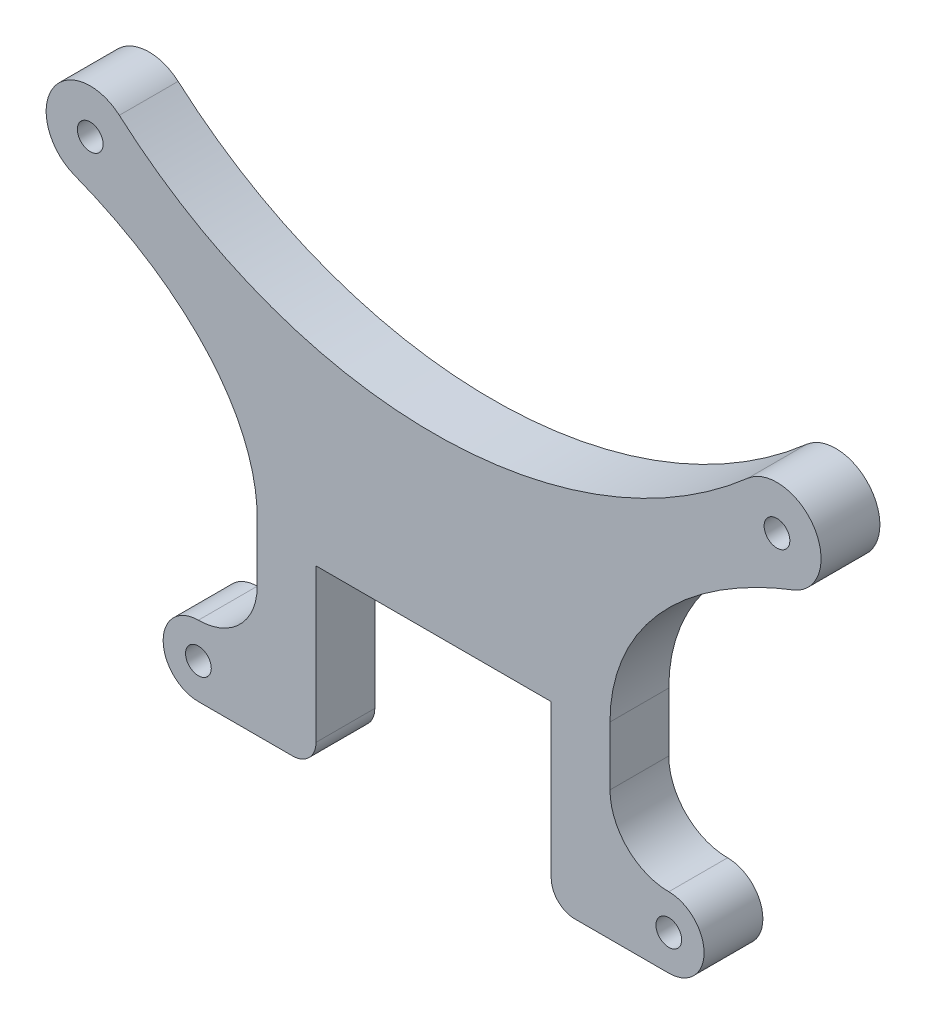
ISO-10303-21;
HEADER;
FILE_DESCRIPTION(('STEP AP214'),'2;1');
FILE_NAME('part.step','',(''),(''),'','','');
FILE_SCHEMA(('AUTOMOTIVE_DESIGN { 1 0 10303 214 1 1 1 1 }'));
ENDSEC;
DATA;
#1=APPLICATION_CONTEXT('core data for automotive mechanical design processes');
#2=APPLICATION_PROTOCOL_DEFINITION('international standard','automotive_design',2000,#1);
#3=PRODUCT_CONTEXT('',#1,'mechanical');
#4=PRODUCT('Part','Part','',(#3));
#5=PRODUCT_RELATED_PRODUCT_CATEGORY('part','',(#4));
#6=PRODUCT_DEFINITION_FORMATION('','',#4);
#7=PRODUCT_DEFINITION_CONTEXT('part definition',#1,'design');
#8=PRODUCT_DEFINITION('design','',#6,#7);
#9=PRODUCT_DEFINITION_SHAPE('','',#8);
#10=(LENGTH_UNIT() NAMED_UNIT(*) SI_UNIT(.MILLI.,.METRE.));
#11=(NAMED_UNIT(*) PLANE_ANGLE_UNIT() SI_UNIT($,.RADIAN.));
#12=(NAMED_UNIT(*) SI_UNIT($,.STERADIAN.) SOLID_ANGLE_UNIT());
#13=UNCERTAINTY_MEASURE_WITH_UNIT(LENGTH_MEASURE(1.E-05),#10,'distance_accuracy_value','');
#14=(GEOMETRIC_REPRESENTATION_CONTEXT(3) GLOBAL_UNCERTAINTY_ASSIGNED_CONTEXT((#13)) GLOBAL_UNIT_ASSIGNED_CONTEXT((#10,
#11,#12)) REPRESENTATION_CONTEXT('',''));
#15=CARTESIAN_POINT('',(0.,0.,0.));
#16=DIRECTION('',(0.,0.,1.));
#17=DIRECTION('',(1.,0.,0.));
#18=AXIS2_PLACEMENT_3D('',#15,#16,#17);
#19=CARTESIAN_POINT('',(-60.8178296691345,1.26999999999986,6.35));
#20=DIRECTION('',(0.,0.,-1.));
#21=DIRECTION('',(-1.,0.,0.));
#22=AXIS2_PLACEMENT_3D('',#19,#20,#21);
#23=PLANE('',#22);
#24=CARTESIAN_POINT('',(25.4,-15.24,6.35));
#25=DIRECTION('',(0.,0.,1.));
#26=DIRECTION('',(-1.,0.,0.));
#27=AXIS2_PLACEMENT_3D('',#24,#25,#26);
#28=CIRCLE('',#27,1.3890625);
#29=CARTESIAN_POINT('',(24.0109375,-15.24,6.35));
#30=VERTEX_POINT('',#29);
#31=EDGE_CURVE('E396',#30,#30,#28,.T.);
#32=ORIENTED_EDGE('',*,*,#31,.F.);
#33=EDGE_LOOP('',(#32));
#34=FACE_BOUND('',#33,.T.);
#35=CARTESIAN_POINT('',(-37.084,27.94,6.35));
#36=DIRECTION('',(0.,0.,1.));
#37=DIRECTION('',(1.,0.,0.));
#38=AXIS2_PLACEMENT_3D('',#35,#36,#37);
#39=CIRCLE('',#38,1.3890625);
#40=CARTESIAN_POINT('',(-35.6949375,27.94,6.35));
#41=VERTEX_POINT('',#40);
#42=EDGE_CURVE('E194',#41,#41,#39,.T.);
#43=ORIENTED_EDGE('',*,*,#42,.F.);
#44=EDGE_LOOP('',(#43));
#45=FACE_BOUND('',#44,.T.);
#46=DIRECTION('',(0.,1.,0.));
#47=VECTOR('',#46,1.);
#48=CARTESIAN_POINT('',(-12.7,0.,6.35));
#49=LINE('',#48,#47);
#50=CARTESIAN_POINT('',(-12.7,-16.51,6.35));
#51=VERTEX_POINT('',#50);
#52=CARTESIAN_POINT('',(-12.7,0.,6.35));
#53=VERTEX_POINT('',#52);
#54=EDGE_CURVE('E225',#51,#53,#49,.T.);
#55=ORIENTED_EDGE('',*,*,#54,.T.);
#56=DIRECTION('',(1.,0.,0.));
#57=VECTOR('',#56,1.);
#58=CARTESIAN_POINT('',(12.7,0.,6.35));
#59=LINE('',#58,#57);
#60=CARTESIAN_POINT('',(12.7,0.,6.35));
#61=VERTEX_POINT('',#60);
#62=EDGE_CURVE('E123',#53,#61,#59,.T.);
#63=ORIENTED_EDGE('',*,*,#62,.T.);
#64=DIRECTION('',(0.,-1.,0.));
#65=VECTOR('',#64,1.);
#66=CARTESIAN_POINT('',(12.7,0.,6.35));
#67=LINE('',#66,#65);
#68=CARTESIAN_POINT('',(12.7,-16.5099999999999,6.35));
#69=VERTEX_POINT('',#68);
#70=EDGE_CURVE('E270',#61,#69,#67,.T.);
#71=ORIENTED_EDGE('',*,*,#70,.T.);
#72=CARTESIAN_POINT('',(15.24,-16.5099999999999,6.35));
#73=DIRECTION('',(0.,0.,1.));
#74=DIRECTION('',(-1.,0.,0.));
#75=AXIS2_PLACEMENT_3D('',#72,#73,#74);
#76=CIRCLE('',#75,2.54);
#77=CARTESIAN_POINT('',(15.24,-19.0499999999999,6.35));
#78=VERTEX_POINT('',#77);
#79=EDGE_CURVE('E289',#69,#78,#76,.T.);
#80=ORIENTED_EDGE('',*,*,#79,.T.);
#81=DIRECTION('',(1.,0.,0.));
#82=VECTOR('',#81,1.);
#83=CARTESIAN_POINT('',(15.24,-19.0499999999999,6.35));
#84=LINE('',#83,#82);
#85=CARTESIAN_POINT('',(25.4,-19.05,6.35));
#86=VERTEX_POINT('',#85);
#87=EDGE_CURVE('E286',#78,#86,#84,.T.);
#88=ORIENTED_EDGE('',*,*,#87,.T.);
#89=CARTESIAN_POINT('',(25.4,-15.24,6.35));
#90=DIRECTION('',(0.,0.,1.));
#91=DIRECTION('',(1.,0.,0.));
#92=AXIS2_PLACEMENT_3D('',#89,#90,#91);
#93=CIRCLE('',#92,3.80999999999999);
#94=CARTESIAN_POINT('',(25.4,-11.43,6.35));
#95=VERTEX_POINT('',#94);
#96=EDGE_CURVE('E288',#86,#95,#93,.T.);
#97=ORIENTED_EDGE('',*,*,#96,.T.);
#98=CARTESIAN_POINT('',(25.4,-5.08,6.35));
#99=DIRECTION('',(0.,0.,-1.));
#100=DIRECTION('',(-1.,0.,0.));
#101=AXIS2_PLACEMENT_3D('',#98,#99,#100);
#102=CIRCLE('',#101,6.35);
#103=CARTESIAN_POINT('',(19.05,-5.08,6.35));
#104=VERTEX_POINT('',#103);
#105=EDGE_CURVE('E291',#95,#104,#102,.T.);
#106=ORIENTED_EDGE('',*,*,#105,.T.);
#107=DIRECTION('',(0.,1.,0.));
#108=VECTOR('',#107,1.);
#109=CARTESIAN_POINT('',(19.05,-5.08,6.35));
#110=LINE('',#109,#108);
#111=CARTESIAN_POINT('',(19.05,1.27,6.35));
#112=VERTEX_POINT('',#111);
#113=EDGE_CURVE('E297',#104,#112,#110,.T.);
#114=ORIENTED_EDGE('',*,*,#113,.T.);
#115=CARTESIAN_POINT('',(60.8178296691344,1.27000000000003,6.35));
#116=DIRECTION('',(0.,0.,-1.));
#117=DIRECTION('',(-1.,0.,0.));
#118=AXIS2_PLACEMENT_3D('',#115,#116,#117);
#119=ELLIPSE('',#118,41.7678296691344,26.1568362866993);
#120=CARTESIAN_POINT('',(38.8078478762059,23.5004334082438,6.35));
#121=VERTEX_POINT('',#120);
#122=EDGE_CURVE('E299',#112,#121,#119,.T.);
#123=ORIENTED_EDGE('',*,*,#122,.T.);
#124=CARTESIAN_POINT('',(37.084,27.94,6.35));
#125=DIRECTION('',(0.,0.,1.));
#126=DIRECTION('',(-1.,0.,0.));
#127=AXIS2_PLACEMENT_3D('',#124,#125,#126);
#128=CIRCLE('',#127,4.76249974590056);
#129=CARTESIAN_POINT('',(33.9417401947675,31.5187717370801,6.35));
#130=VERTEX_POINT('',#129);
#131=EDGE_CURVE('E302',#121,#130,#128,.T.);
#132=ORIENTED_EDGE('',*,*,#131,.T.);
#133=CARTESIAN_POINT('',(0.,70.1755818181818,6.35));
#134=DIRECTION('',(0.,0.,-1.));
#135=DIRECTION('',(-1.,0.,0.));
#136=AXIS2_PLACEMENT_3D('',#133,#134,#135);
#137=CIRCLE('',#136,51.4430819875814);
#138=CARTESIAN_POINT('',(-33.9417401388833,31.5187718007276,6.35));
#139=VERTEX_POINT('',#138);
#140=EDGE_CURVE('E589',#130,#139,#137,.T.);
#141=ORIENTED_EDGE('',*,*,#140,.T.);
#142=CARTESIAN_POINT('',(-37.084,27.94,6.35));
#143=DIRECTION('',(0.,0.,1.));
#144=DIRECTION('',(1.,0.,0.));
#145=AXIS2_PLACEMENT_3D('',#142,#143,#144);
#146=CIRCLE('',#145,4.76249974590056);
#147=CARTESIAN_POINT('',(-38.807847906864,23.5004333292873,6.35));
#148=VERTEX_POINT('',#147);
#149=EDGE_CURVE('E375',#139,#148,#146,.T.);
#150=ORIENTED_EDGE('',*,*,#149,.T.);
#151=CARTESIAN_POINT('',(-60.8178296691345,1.26999999999986,6.35));
#152=DIRECTION('',(0.,0.,-1.));
#153=DIRECTION('',(1.,0.,0.));
#154=AXIS2_PLACEMENT_3D('',#151,#152,#153);
#155=ELLIPSE('',#154,41.7678296691345,26.1568362866994);
#156=CARTESIAN_POINT('',(-19.05,1.27,6.35));
#157=VERTEX_POINT('',#156);
#158=EDGE_CURVE('E370',#148,#157,#155,.T.);
#159=ORIENTED_EDGE('',*,*,#158,.T.);
#160=DIRECTION('',(0.,-1.,0.));
#161=VECTOR('',#160,1.);
#162=CARTESIAN_POINT('',(-19.05,-5.08,6.35));
#163=LINE('',#162,#161);
#164=CARTESIAN_POINT('',(-19.05,-5.08,6.35));
#165=VERTEX_POINT('',#164);
#166=EDGE_CURVE('E374',#157,#165,#163,.T.);
#167=ORIENTED_EDGE('',*,*,#166,.T.);
#168=CARTESIAN_POINT('',(-25.4,-5.08,6.35));
#169=DIRECTION('',(0.,0.,-1.));
#170=DIRECTION('',(1.,0.,0.));
#171=AXIS2_PLACEMENT_3D('',#168,#169,#170);
#172=CIRCLE('',#171,6.35);
#173=CARTESIAN_POINT('',(-25.4,-11.43,6.35));
#174=VERTEX_POINT('',#173);
#175=EDGE_CURVE('E172',#165,#174,#172,.T.);
#176=ORIENTED_EDGE('',*,*,#175,.T.);
#177=CARTESIAN_POINT('',(-25.4,-15.24,6.35));
#178=DIRECTION('',(0.,0.,1.));
#179=DIRECTION('',(-1.,0.,0.));
#180=AXIS2_PLACEMENT_3D('',#177,#178,#179);
#181=CIRCLE('',#180,3.80999999999999);
#182=CARTESIAN_POINT('',(-25.4,-19.05,6.35));
#183=VERTEX_POINT('',#182);
#184=EDGE_CURVE('E166',#174,#183,#181,.T.);
#185=ORIENTED_EDGE('',*,*,#184,.T.);
#186=DIRECTION('',(1.,0.,0.));
#187=VECTOR('',#186,1.);
#188=CARTESIAN_POINT('',(-15.24,-19.05,6.35));
#189=LINE('',#188,#187);
#190=CARTESIAN_POINT('',(-15.24,-19.05,6.35));
#191=VERTEX_POINT('',#190);
#192=EDGE_CURVE('E170',#183,#191,#189,.T.);
#193=ORIENTED_EDGE('',*,*,#192,.T.);
#194=CARTESIAN_POINT('',(-15.24,-16.51,6.35));
#195=DIRECTION('',(0.,0.,1.));
#196=DIRECTION('',(1.,0.,0.));
#197=AXIS2_PLACEMENT_3D('',#194,#195,#196);
#198=CIRCLE('',#197,2.54);
#199=EDGE_CURVE('E50',#191,#51,#198,.T.);
#200=ORIENTED_EDGE('',*,*,#199,.T.);
#201=EDGE_LOOP('',(#55,#63,#71,#80,#88,#97,#106,#114,#123,#132,#141,#150,#159,#167,#176,#185,
#193,#200));
#202=FACE_BOUND('',#201,.T.);
#203=CARTESIAN_POINT('',(-25.4,-15.24,6.35));
#204=DIRECTION('',(0.,0.,1.));
#205=DIRECTION('',(1.,0.,0.));
#206=AXIS2_PLACEMENT_3D('',#203,#204,#205);
#207=CIRCLE('',#206,1.3890625);
#208=CARTESIAN_POINT('',(-24.0109375,-15.24,6.35));
#209=VERTEX_POINT('',#208);
#210=EDGE_CURVE('E390',#209,#209,#207,.T.);
#211=ORIENTED_EDGE('',*,*,#210,.F.);
#212=EDGE_LOOP('',(#211));
#213=FACE_BOUND('',#212,.T.);
#214=CARTESIAN_POINT('',(37.084,27.94,6.35));
#215=DIRECTION('',(0.,0.,1.));
#216=DIRECTION('',(-1.,0.,0.));
#217=AXIS2_PLACEMENT_3D('',#214,#215,#216);
#218=CIRCLE('',#217,1.3890625);
#219=CARTESIAN_POINT('',(35.6949375,27.94,6.35));
#220=VERTEX_POINT('',#219);
#221=EDGE_CURVE('E402',#220,#220,#218,.T.);
#222=ORIENTED_EDGE('',*,*,#221,.F.);
#223=EDGE_LOOP('',(#222));
#224=FACE_BOUND('',#223,.T.);
#225=ADVANCED_FACE('F33',(#34,#45,#202,#213,#224),#23,.F.);
#226=CARTESIAN_POINT('',(-60.8178296691345,1.26999999999986,0.));
#227=DIRECTION('',(0.,0.,-1.));
#228=DIRECTION('',(-1.,0.,0.));
#229=AXIS2_PLACEMENT_3D('',#226,#227,#228);
#230=PLANE('',#229);
#231=CARTESIAN_POINT('',(25.4,-15.24,0.));
#232=DIRECTION('',(0.,0.,1.));
#233=DIRECTION('',(-1.,0.,0.));
#234=AXIS2_PLACEMENT_3D('',#231,#232,#233);
#235=CIRCLE('',#234,1.3890625);
#236=CARTESIAN_POINT('',(24.0109375,-15.24,0.));
#237=VERTEX_POINT('',#236);
#238=EDGE_CURVE('E399',#237,#237,#235,.T.);
#239=ORIENTED_EDGE('',*,*,#238,.T.);
#240=EDGE_LOOP('',(#239));
#241=FACE_BOUND('',#240,.T.);
#242=CARTESIAN_POINT('',(-37.084,27.94,0.));
#243=DIRECTION('',(0.,0.,1.));
#244=DIRECTION('',(1.,0.,0.));
#245=AXIS2_PLACEMENT_3D('',#242,#243,#244);
#246=CIRCLE('',#245,1.3890625);
#247=CARTESIAN_POINT('',(-35.6949375,27.94,0.));
#248=VERTEX_POINT('',#247);
#249=EDGE_CURVE('E387',#248,#248,#246,.T.);
#250=ORIENTED_EDGE('',*,*,#249,.T.);
#251=EDGE_LOOP('',(#250));
#252=FACE_BOUND('',#251,.T.);
#253=DIRECTION('',(0.,1.,0.));
#254=VECTOR('',#253,1.);
#255=CARTESIAN_POINT('',(-12.7,0.,0.));
#256=LINE('',#255,#254);
#257=CARTESIAN_POINT('',(-12.7,-16.51,0.));
#258=VERTEX_POINT('',#257);
#259=CARTESIAN_POINT('',(-12.7,0.,0.));
#260=VERTEX_POINT('',#259);
#261=EDGE_CURVE('E190',#258,#260,#256,.T.);
#262=ORIENTED_EDGE('',*,*,#261,.F.);
#263=CARTESIAN_POINT('',(-15.24,-16.51,0.));
#264=DIRECTION('',(0.,0.,1.));
#265=DIRECTION('',(1.,0.,0.));
#266=AXIS2_PLACEMENT_3D('',#263,#264,#265);
#267=CIRCLE('',#266,2.54);
#268=CARTESIAN_POINT('',(-15.24,-19.05,0.));
#269=VERTEX_POINT('',#268);
#270=EDGE_CURVE('E115',#269,#258,#267,.T.);
#271=ORIENTED_EDGE('',*,*,#270,.F.);
#272=DIRECTION('',(1.,0.,0.));
#273=VECTOR('',#272,1.);
#274=CARTESIAN_POINT('',(-15.24,-19.05,0.));
#275=LINE('',#274,#273);
#276=CARTESIAN_POINT('',(-25.4,-19.05,0.));
#277=VERTEX_POINT('',#276);
#278=EDGE_CURVE('E109',#277,#269,#275,.T.);
#279=ORIENTED_EDGE('',*,*,#278,.F.);
#280=CARTESIAN_POINT('',(-25.4,-15.24,0.));
#281=DIRECTION('',(0.,0.,1.));
#282=DIRECTION('',(-1.,0.,0.));
#283=AXIS2_PLACEMENT_3D('',#280,#281,#282);
#284=CIRCLE('',#283,3.80999999999999);
#285=CARTESIAN_POINT('',(-25.4,-11.43,0.));
#286=VERTEX_POINT('',#285);
#287=EDGE_CURVE('E180',#286,#277,#284,.T.);
#288=ORIENTED_EDGE('',*,*,#287,.F.);
#289=CARTESIAN_POINT('',(-25.4,-5.08,0.));
#290=DIRECTION('',(0.,0.,-1.));
#291=DIRECTION('',(1.,0.,0.));
#292=AXIS2_PLACEMENT_3D('',#289,#290,#291);
#293=CIRCLE('',#292,6.35);
#294=CARTESIAN_POINT('',(-19.05,-5.08,0.));
#295=VERTEX_POINT('',#294);
#296=EDGE_CURVE('E220',#295,#286,#293,.T.);
#297=ORIENTED_EDGE('',*,*,#296,.F.);
#298=DIRECTION('',(0.,-1.,0.));
#299=VECTOR('',#298,1.);
#300=CARTESIAN_POINT('',(-19.05,-5.08,0.));
#301=LINE('',#300,#299);
#302=CARTESIAN_POINT('',(-19.05,1.27,0.));
#303=VERTEX_POINT('',#302);
#304=EDGE_CURVE('E218',#303,#295,#301,.T.);
#305=ORIENTED_EDGE('',*,*,#304,.F.);
#306=CARTESIAN_POINT('',(-60.8178296691345,1.26999999999986,0.));
#307=DIRECTION('',(0.,0.,-1.));
#308=DIRECTION('',(1.,0.,0.));
#309=AXIS2_PLACEMENT_3D('',#306,#307,#308);
#310=ELLIPSE('',#309,41.7678296691345,26.1568362866994);
#311=CARTESIAN_POINT('',(-38.807847906864,23.5004333292873,0.));
#312=VERTEX_POINT('',#311);
#313=EDGE_CURVE('E216',#312,#303,#310,.T.);
#314=ORIENTED_EDGE('',*,*,#313,.F.);
#315=CARTESIAN_POINT('',(-37.084,27.94,0.));
#316=DIRECTION('',(0.,0.,1.));
#317=DIRECTION('',(1.,0.,0.));
#318=AXIS2_PLACEMENT_3D('',#315,#316,#317);
#319=CIRCLE('',#318,4.76249974590056);
#320=CARTESIAN_POINT('',(-33.9417401388833,31.5187718007276,0.));
#321=VERTEX_POINT('',#320);
#322=EDGE_CURVE('E214',#321,#312,#319,.T.);
#323=ORIENTED_EDGE('',*,*,#322,.F.);
#324=CARTESIAN_POINT('',(0.,70.1755818181818,0.));
#325=DIRECTION('',(0.,0.,-1.));
#326=DIRECTION('',(-1.,0.,0.));
#327=AXIS2_PLACEMENT_3D('',#324,#325,#326);
#328=CIRCLE('',#327,51.4430819875814);
#329=CARTESIAN_POINT('',(33.9417401947675,31.5187717370801,0.));
#330=VERTEX_POINT('',#329);
#331=EDGE_CURVE('E212',#330,#321,#328,.T.);
#332=ORIENTED_EDGE('',*,*,#331,.F.);
#333=CARTESIAN_POINT('',(37.084,27.94,0.));
#334=DIRECTION('',(0.,0.,1.));
#335=DIRECTION('',(-1.,0.,0.));
#336=AXIS2_PLACEMENT_3D('',#333,#334,#335);
#337=CIRCLE('',#336,4.76249974590056);
#338=CARTESIAN_POINT('',(38.8078478762059,23.5004334082438,0.));
#339=VERTEX_POINT('',#338);
#340=EDGE_CURVE('E210',#339,#330,#337,.T.);
#341=ORIENTED_EDGE('',*,*,#340,.F.);
#342=CARTESIAN_POINT('',(60.8178296691344,1.27000000000003,0.));
#343=DIRECTION('',(0.,0.,-1.));
#344=DIRECTION('',(-1.,0.,0.));
#345=AXIS2_PLACEMENT_3D('',#342,#343,#344);
#346=ELLIPSE('',#345,41.7678296691344,26.1568362866993);
#347=CARTESIAN_POINT('',(19.05,1.27,0.));
#348=VERTEX_POINT('',#347);
#349=EDGE_CURVE('E208',#348,#339,#346,.T.);
#350=ORIENTED_EDGE('',*,*,#349,.F.);
#351=DIRECTION('',(0.,1.,0.));
#352=VECTOR('',#351,1.);
#353=CARTESIAN_POINT('',(19.05,-5.08,0.));
#354=LINE('',#353,#352);
#355=CARTESIAN_POINT('',(19.05,-5.08,0.));
#356=VERTEX_POINT('',#355);
#357=EDGE_CURVE('E206',#356,#348,#354,.T.);
#358=ORIENTED_EDGE('',*,*,#357,.F.);
#359=CARTESIAN_POINT('',(25.4,-5.08,0.));
#360=DIRECTION('',(0.,0.,-1.));
#361=DIRECTION('',(-1.,0.,0.));
#362=AXIS2_PLACEMENT_3D('',#359,#360,#361);
#363=CIRCLE('',#362,6.35);
#364=CARTESIAN_POINT('',(25.4,-11.43,0.));
#365=VERTEX_POINT('',#364);
#366=EDGE_CURVE('E204',#365,#356,#363,.T.);
#367=ORIENTED_EDGE('',*,*,#366,.F.);
#368=CARTESIAN_POINT('',(25.4,-15.24,0.));
#369=DIRECTION('',(0.,0.,1.));
#370=DIRECTION('',(1.,0.,0.));
#371=AXIS2_PLACEMENT_3D('',#368,#369,#370);
#372=CIRCLE('',#371,3.80999999999999);
#373=CARTESIAN_POINT('',(25.4,-19.05,0.));
#374=VERTEX_POINT('',#373);
#375=EDGE_CURVE('E202',#374,#365,#372,.T.);
#376=ORIENTED_EDGE('',*,*,#375,.F.);
#377=DIRECTION('',(1.,0.,0.));
#378=VECTOR('',#377,1.);
#379=CARTESIAN_POINT('',(15.24,-19.0499999999999,0.));
#380=LINE('',#379,#378);
#381=CARTESIAN_POINT('',(15.24,-19.0499999999999,0.));
#382=VERTEX_POINT('',#381);
#383=EDGE_CURVE('E200',#382,#374,#380,.T.);
#384=ORIENTED_EDGE('',*,*,#383,.F.);
#385=CARTESIAN_POINT('',(15.24,-16.5099999999999,0.));
#386=DIRECTION('',(0.,0.,1.));
#387=DIRECTION('',(-1.,0.,0.));
#388=AXIS2_PLACEMENT_3D('',#385,#386,#387);
#389=CIRCLE('',#388,2.54);
#390=CARTESIAN_POINT('',(12.7,-16.5099999999999,0.));
#391=VERTEX_POINT('',#390);
#392=EDGE_CURVE('E198',#391,#382,#389,.T.);
#393=ORIENTED_EDGE('',*,*,#392,.F.);
#394=DIRECTION('',(0.,-1.,0.));
#395=VECTOR('',#394,1.);
#396=CARTESIAN_POINT('',(12.7,0.,0.));
#397=LINE('',#396,#395);
#398=CARTESIAN_POINT('',(12.7,0.,0.));
#399=VERTEX_POINT('',#398);
#400=EDGE_CURVE('E196',#399,#391,#397,.T.);
#401=ORIENTED_EDGE('',*,*,#400,.F.);
#402=DIRECTION('',(1.,0.,0.));
#403=VECTOR('',#402,1.);
#404=CARTESIAN_POINT('',(12.7,0.,0.));
#405=LINE('',#404,#403);
#406=EDGE_CURVE('E193',#260,#399,#405,.T.);
#407=ORIENTED_EDGE('',*,*,#406,.F.);
#408=EDGE_LOOP('',(#262,#271,#279,#288,#297,#305,#314,#323,#332,#341,#350,#358,#367,#376,#384,
#393,#401,#407));
#409=FACE_BOUND('',#408,.T.);
#410=CARTESIAN_POINT('',(-25.4,-15.24,0.));
#411=DIRECTION('',(0.,0.,1.));
#412=DIRECTION('',(1.,0.,0.));
#413=AXIS2_PLACEMENT_3D('',#410,#411,#412);
#414=CIRCLE('',#413,1.3890625);
#415=CARTESIAN_POINT('',(-24.0109375,-15.24,0.));
#416=VERTEX_POINT('',#415);
#417=EDGE_CURVE('E393',#416,#416,#414,.T.);
#418=ORIENTED_EDGE('',*,*,#417,.T.);
#419=EDGE_LOOP('',(#418));
#420=FACE_BOUND('',#419,.T.);
#421=CARTESIAN_POINT('',(37.084,27.94,0.));
#422=DIRECTION('',(0.,0.,1.));
#423=DIRECTION('',(-1.,0.,0.));
#424=AXIS2_PLACEMENT_3D('',#421,#422,#423);
#425=CIRCLE('',#424,1.3890625);
#426=CARTESIAN_POINT('',(35.6949375,27.94,0.));
#427=VERTEX_POINT('',#426);
#428=EDGE_CURVE('E405',#427,#427,#425,.T.);
#429=ORIENTED_EDGE('',*,*,#428,.T.);
#430=EDGE_LOOP('',(#429));
#431=FACE_BOUND('',#430,.T.);
#432=ADVANCED_FACE('F274',(#241,#252,#409,#420,#431),#230,.T.);
#433=CARTESIAN_POINT('',(-12.7,0.,6.35));
#434=DIRECTION('',(-1.,0.,0.));
#435=DIRECTION('',(0.,-1.,0.));
#436=AXIS2_PLACEMENT_3D('',#433,#434,#435);
#437=PLANE('',#436);
#438=ORIENTED_EDGE('',*,*,#261,.T.);
#439=DIRECTION('',(0.,0.,-1.));
#440=VECTOR('',#439,1.);
#441=CARTESIAN_POINT('',(-12.7,0.,6.35));
#442=LINE('',#441,#440);
#443=EDGE_CURVE('E11',#53,#260,#442,.T.);
#444=ORIENTED_EDGE('',*,*,#443,.F.);
#445=ORIENTED_EDGE('',*,*,#54,.F.);
#446=DIRECTION('',(0.,0.,-1.));
#447=VECTOR('',#446,1.);
#448=CARTESIAN_POINT('',(-12.7,-16.51,6.35));
#449=LINE('',#448,#447);
#450=EDGE_CURVE('E186',#51,#258,#449,.T.);
#451=ORIENTED_EDGE('',*,*,#450,.T.);
#452=EDGE_LOOP('',(#438,#444,#445,#451));
#453=FACE_BOUND('',#452,.T.);
#454=ADVANCED_FACE('F35',(#453),#437,.F.);
#455=CARTESIAN_POINT('',(12.7,0.,6.35));
#456=DIRECTION('',(0.,1.,0.));
#457=DIRECTION('',(-1.,0.,0.));
#458=AXIS2_PLACEMENT_3D('',#455,#456,#457);
#459=PLANE('',#458);
#460=ORIENTED_EDGE('',*,*,#406,.T.);
#461=DIRECTION('',(0.,0.,-1.));
#462=VECTOR('',#461,1.);
#463=CARTESIAN_POINT('',(12.7,0.,6.35));
#464=LINE('',#463,#462);
#465=EDGE_CURVE('E42',#61,#399,#464,.T.);
#466=ORIENTED_EDGE('',*,*,#465,.F.);
#467=ORIENTED_EDGE('',*,*,#62,.F.);
#468=ORIENTED_EDGE('',*,*,#443,.T.);
#469=EDGE_LOOP('',(#460,#466,#467,#468));
#470=FACE_BOUND('',#469,.T.);
#471=ADVANCED_FACE('F329',(#470),#459,.F.);
#472=CARTESIAN_POINT('',(12.7,0.,6.35));
#473=DIRECTION('',(1.,0.,0.));
#474=DIRECTION('',(0.,1.,0.));
#475=AXIS2_PLACEMENT_3D('',#472,#473,#474);
#476=PLANE('',#475);
#477=ORIENTED_EDGE('',*,*,#400,.T.);
#478=DIRECTION('',(0.,0.,-1.));
#479=VECTOR('',#478,1.);
#480=CARTESIAN_POINT('',(12.7,-16.5099999999999,6.35));
#481=LINE('',#480,#479);
#482=EDGE_CURVE('E262',#69,#391,#481,.T.);
#483=ORIENTED_EDGE('',*,*,#482,.F.);
#484=ORIENTED_EDGE('',*,*,#70,.F.);
#485=ORIENTED_EDGE('',*,*,#465,.T.);
#486=EDGE_LOOP('',(#477,#483,#484,#485));
#487=FACE_BOUND('',#486,.T.);
#488=ADVANCED_FACE('F268',(#487),#476,.F.);
#489=CARTESIAN_POINT('',(15.24,-16.5099999999999,6.35));
#490=DIRECTION('',(0.,0.,-1.));
#491=DIRECTION('',(-1.,0.,0.));
#492=AXIS2_PLACEMENT_3D('',#489,#490,#491);
#493=CYLINDRICAL_SURFACE('',#492,2.54);
#494=ORIENTED_EDGE('',*,*,#392,.T.);
#495=DIRECTION('',(0.,0.,-1.));
#496=VECTOR('',#495,1.);
#497=CARTESIAN_POINT('',(15.24,-19.0499999999999,6.35));
#498=LINE('',#497,#496);
#499=EDGE_CURVE('E259',#78,#382,#498,.T.);
#500=ORIENTED_EDGE('',*,*,#499,.F.);
#501=ORIENTED_EDGE('',*,*,#79,.F.);
#502=ORIENTED_EDGE('',*,*,#482,.T.);
#503=EDGE_LOOP('',(#494,#500,#501,#502));
#504=FACE_BOUND('',#503,.T.);
#505=ADVANCED_FACE('F280',(#504),#493,.T.);
#506=CARTESIAN_POINT('',(15.24,-19.0499999999999,6.35));
#507=DIRECTION('',(0.,1.,0.));
#508=DIRECTION('',(-1.,0.,0.));
#509=AXIS2_PLACEMENT_3D('',#506,#507,#508);
#510=PLANE('',#509);
#511=ORIENTED_EDGE('',*,*,#383,.T.);
#512=DIRECTION('',(0.,0.,-1.));
#513=VECTOR('',#512,1.);
#514=CARTESIAN_POINT('',(25.4,-19.05,6.35));
#515=LINE('',#514,#513);
#516=EDGE_CURVE('E256',#86,#374,#515,.T.);
#517=ORIENTED_EDGE('',*,*,#516,.F.);
#518=ORIENTED_EDGE('',*,*,#87,.F.);
#519=ORIENTED_EDGE('',*,*,#499,.T.);
#520=EDGE_LOOP('',(#511,#517,#518,#519));
#521=FACE_BOUND('',#520,.T.);
#522=ADVANCED_FACE('F284',(#521),#510,.F.);
#523=CARTESIAN_POINT('',(25.4,-15.24,6.35));
#524=DIRECTION('',(0.,0.,-1.));
#525=DIRECTION('',(-1.,0.,0.));
#526=AXIS2_PLACEMENT_3D('',#523,#524,#525);
#527=CYLINDRICAL_SURFACE('',#526,3.80999999999999);
#528=ORIENTED_EDGE('',*,*,#375,.T.);
#529=DIRECTION('',(0.,0.,-1.));
#530=VECTOR('',#529,1.);
#531=CARTESIAN_POINT('',(25.4,-11.43,6.35));
#532=LINE('',#531,#530);
#533=EDGE_CURVE('E253',#95,#365,#532,.T.);
#534=ORIENTED_EDGE('',*,*,#533,.F.);
#535=ORIENTED_EDGE('',*,*,#96,.F.);
#536=ORIENTED_EDGE('',*,*,#516,.T.);
#537=EDGE_LOOP('',(#528,#534,#535,#536));
#538=FACE_BOUND('',#537,.T.);
#539=ADVANCED_FACE('F319',(#538),#527,.T.);
#540=CARTESIAN_POINT('',(25.4,-5.08,6.35));
#541=DIRECTION('',(0.,0.,-1.));
#542=DIRECTION('',(-1.,0.,0.));
#543=AXIS2_PLACEMENT_3D('',#540,#541,#542);
#544=CYLINDRICAL_SURFACE('',#543,6.35);
#545=ORIENTED_EDGE('',*,*,#366,.T.);
#546=DIRECTION('',(0.,0.,-1.));
#547=VECTOR('',#546,1.);
#548=CARTESIAN_POINT('',(19.05,-5.08,6.35));
#549=LINE('',#548,#547);
#550=EDGE_CURVE('E250',#104,#356,#549,.T.);
#551=ORIENTED_EDGE('',*,*,#550,.F.);
#552=ORIENTED_EDGE('',*,*,#105,.F.);
#553=ORIENTED_EDGE('',*,*,#533,.T.);
#554=EDGE_LOOP('',(#545,#551,#552,#553));
#555=FACE_BOUND('',#554,.T.);
#556=ADVANCED_FACE('F315',(#555),#544,.F.);
#557=CARTESIAN_POINT('',(19.05,-5.08,6.35));
#558=DIRECTION('',(-1.,0.,0.));
#559=DIRECTION('',(0.,-1.,0.));
#560=AXIS2_PLACEMENT_3D('',#557,#558,#559);
#561=PLANE('',#560);
#562=ORIENTED_EDGE('',*,*,#357,.T.);
#563=DIRECTION('',(0.,0.,-1.));
#564=VECTOR('',#563,1.);
#565=CARTESIAN_POINT('',(19.05,1.27,6.35));
#566=LINE('',#565,#564);
#567=EDGE_CURVE('E247',#112,#348,#566,.T.);
#568=ORIENTED_EDGE('',*,*,#567,.F.);
#569=ORIENTED_EDGE('',*,*,#113,.F.);
#570=ORIENTED_EDGE('',*,*,#550,.T.);
#571=EDGE_LOOP('',(#562,#568,#569,#570));
#572=FACE_BOUND('',#571,.T.);
#573=ADVANCED_FACE('F310',(#572),#561,.F.);
#574=DIRECTION('',(0.,0.,-1.));
#575=VECTOR('',#574,1.);
#576=SURFACE_OF_LINEAR_EXTRUSION('',#119,#575);
#577=ORIENTED_EDGE('',*,*,#349,.T.);
#578=DIRECTION('',(0.,0.,-1.));
#579=VECTOR('',#578,1.);
#580=CARTESIAN_POINT('',(38.8078478762059,23.5004334082438,6.35));
#581=LINE('',#580,#579);
#582=EDGE_CURVE('E244',#121,#339,#581,.T.);
#583=ORIENTED_EDGE('',*,*,#582,.F.);
#584=ORIENTED_EDGE('',*,*,#122,.F.);
#585=ORIENTED_EDGE('',*,*,#567,.T.);
#586=EDGE_LOOP('',(#577,#583,#584,#585));
#587=FACE_BOUND('',#586,.T.);
#588=ADVANCED_FACE('F305',(#587),#576,.F.);
#589=CARTESIAN_POINT('',(37.084,27.94,6.35));
#590=DIRECTION('',(0.,0.,-1.));
#591=DIRECTION('',(-1.,0.,0.));
#592=AXIS2_PLACEMENT_3D('',#589,#590,#591);
#593=CYLINDRICAL_SURFACE('',#592,4.76249974590056);
#594=ORIENTED_EDGE('',*,*,#340,.T.);
#595=DIRECTION('',(0.,0.,-1.));
#596=VECTOR('',#595,1.);
#597=CARTESIAN_POINT('',(33.9417401947675,31.5187717370801,6.35));
#598=LINE('',#597,#596);
#599=EDGE_CURVE('E241',#130,#330,#598,.T.);
#600=ORIENTED_EDGE('',*,*,#599,.F.);
#601=ORIENTED_EDGE('',*,*,#131,.F.);
#602=ORIENTED_EDGE('',*,*,#582,.T.);
#603=EDGE_LOOP('',(#594,#600,#601,#602));
#604=FACE_BOUND('',#603,.T.);
#605=ADVANCED_FACE('F309',(#604),#593,.T.);
#606=CARTESIAN_POINT('',(0.,70.1755818181818,6.35));
#607=DIRECTION('',(0.,0.,-1.));
#608=DIRECTION('',(-1.,0.,0.));
#609=AXIS2_PLACEMENT_3D('',#606,#607,#608);
#610=CYLINDRICAL_SURFACE('',#609,51.4430819875814);
#611=ORIENTED_EDGE('',*,*,#331,.T.);
#612=DIRECTION('',(0.,0.,-1.));
#613=VECTOR('',#612,1.);
#614=CARTESIAN_POINT('',(-33.9417401388833,31.5187718007276,6.35));
#615=LINE('',#614,#613);
#616=EDGE_CURVE('E238',#139,#321,#615,.T.);
#617=ORIENTED_EDGE('',*,*,#616,.F.);
#618=ORIENTED_EDGE('',*,*,#140,.F.);
#619=ORIENTED_EDGE('',*,*,#599,.T.);
#620=EDGE_LOOP('',(#611,#617,#618,#619));
#621=FACE_BOUND('',#620,.T.);
#622=ADVANCED_FACE('F470',(#621),#610,.F.);
#623=CARTESIAN_POINT('',(-37.084,27.94,6.35));
#624=DIRECTION('',(0.,0.,-1.));
#625=DIRECTION('',(-1.,0.,0.));
#626=AXIS2_PLACEMENT_3D('',#623,#624,#625);
#627=CYLINDRICAL_SURFACE('',#626,4.76249974590056);
#628=ORIENTED_EDGE('',*,*,#322,.T.);
#629=DIRECTION('',(0.,0.,-1.));
#630=VECTOR('',#629,1.);
#631=CARTESIAN_POINT('',(-38.807847906864,23.5004333292873,6.35));
#632=LINE('',#631,#630);
#633=EDGE_CURVE('E235',#148,#312,#632,.T.);
#634=ORIENTED_EDGE('',*,*,#633,.F.);
#635=ORIENTED_EDGE('',*,*,#149,.F.);
#636=ORIENTED_EDGE('',*,*,#616,.T.);
#637=EDGE_LOOP('',(#628,#634,#635,#636));
#638=FACE_BOUND('',#637,.T.);
#639=ADVANCED_FACE('F368',(#638),#627,.T.);
#640=DIRECTION('',(0.,0.,-1.));
#641=VECTOR('',#640,1.);
#642=SURFACE_OF_LINEAR_EXTRUSION('',#155,#641);
#643=ORIENTED_EDGE('',*,*,#313,.T.);
#644=DIRECTION('',(0.,0.,-1.));
#645=VECTOR('',#644,1.);
#646=CARTESIAN_POINT('',(-19.05,1.27,6.35));
#647=LINE('',#646,#645);
#648=EDGE_CURVE('E232',#157,#303,#647,.T.);
#649=ORIENTED_EDGE('',*,*,#648,.F.);
#650=ORIENTED_EDGE('',*,*,#158,.F.);
#651=ORIENTED_EDGE('',*,*,#633,.T.);
#652=EDGE_LOOP('',(#643,#649,#650,#651));
#653=FACE_BOUND('',#652,.T.);
#654=ADVANCED_FACE('F363',(#653),#642,.F.);
#655=CARTESIAN_POINT('',(-19.05,-5.08,6.35));
#656=DIRECTION('',(1.,0.,0.));
#657=DIRECTION('',(0.,1.,0.));
#658=AXIS2_PLACEMENT_3D('',#655,#656,#657);
#659=PLANE('',#658);
#660=ORIENTED_EDGE('',*,*,#304,.T.);
#661=DIRECTION('',(0.,0.,-1.));
#662=VECTOR('',#661,1.);
#663=CARTESIAN_POINT('',(-19.05,-5.08,6.35));
#664=LINE('',#663,#662);
#665=EDGE_CURVE('E229',#165,#295,#664,.T.);
#666=ORIENTED_EDGE('',*,*,#665,.F.);
#667=ORIENTED_EDGE('',*,*,#166,.F.);
#668=ORIENTED_EDGE('',*,*,#648,.T.);
#669=EDGE_LOOP('',(#660,#666,#667,#668));
#670=FACE_BOUND('',#669,.T.);
#671=ADVANCED_FACE('F359',(#670),#659,.F.);
#672=CARTESIAN_POINT('',(-25.4,-5.08,6.35));
#673=DIRECTION('',(0.,0.,-1.));
#674=DIRECTION('',(-1.,0.,0.));
#675=AXIS2_PLACEMENT_3D('',#672,#673,#674);
#676=CYLINDRICAL_SURFACE('',#675,6.35);
#677=ORIENTED_EDGE('',*,*,#296,.T.);
#678=DIRECTION('',(0.,0.,-1.));
#679=VECTOR('',#678,1.);
#680=CARTESIAN_POINT('',(-25.4,-11.43,6.35));
#681=LINE('',#680,#679);
#682=EDGE_CURVE('E181',#174,#286,#681,.T.);
#683=ORIENTED_EDGE('',*,*,#682,.F.);
#684=ORIENTED_EDGE('',*,*,#175,.F.);
#685=ORIENTED_EDGE('',*,*,#665,.T.);
#686=EDGE_LOOP('',(#677,#683,#684,#685));
#687=FACE_BOUND('',#686,.T.);
#688=ADVANCED_FACE('F356',(#687),#676,.F.);
#689=CARTESIAN_POINT('',(-25.4,-15.24,6.35));
#690=DIRECTION('',(0.,0.,-1.));
#691=DIRECTION('',(-1.,0.,0.));
#692=AXIS2_PLACEMENT_3D('',#689,#690,#691);
#693=CYLINDRICAL_SURFACE('',#692,3.80999999999999);
#694=ORIENTED_EDGE('',*,*,#287,.T.);
#695=DIRECTION('',(0.,0.,-1.));
#696=VECTOR('',#695,1.);
#697=CARTESIAN_POINT('',(-25.4,-19.05,6.35));
#698=LINE('',#697,#696);
#699=EDGE_CURVE('E177',#183,#277,#698,.T.);
#700=ORIENTED_EDGE('',*,*,#699,.F.);
#701=ORIENTED_EDGE('',*,*,#184,.F.);
#702=ORIENTED_EDGE('',*,*,#682,.T.);
#703=EDGE_LOOP('',(#694,#700,#701,#702));
#704=FACE_BOUND('',#703,.T.);
#705=ADVANCED_FACE('F178',(#704),#693,.T.);
#706=CARTESIAN_POINT('',(-15.24,-19.05,6.35));
#707=DIRECTION('',(0.,1.,0.));
#708=DIRECTION('',(0.,0.,1.));
#709=AXIS2_PLACEMENT_3D('',#706,#707,#708);
#710=PLANE('',#709);
#711=ORIENTED_EDGE('',*,*,#278,.T.);
#712=DIRECTION('',(0.,0.,-1.));
#713=VECTOR('',#712,1.);
#714=CARTESIAN_POINT('',(-15.24,-19.05,6.35));
#715=LINE('',#714,#713);
#716=EDGE_CURVE('E182',#191,#269,#715,.T.);
#717=ORIENTED_EDGE('',*,*,#716,.F.);
#718=ORIENTED_EDGE('',*,*,#192,.F.);
#719=ORIENTED_EDGE('',*,*,#699,.T.);
#720=EDGE_LOOP('',(#711,#717,#718,#719));
#721=FACE_BOUND('',#720,.T.);
#722=ADVANCED_FACE('F184',(#721),#710,.F.);
#723=CARTESIAN_POINT('',(-15.24,-16.51,6.35));
#724=DIRECTION('',(0.,0.,-1.));
#725=DIRECTION('',(-1.,0.,0.));
#726=AXIS2_PLACEMENT_3D('',#723,#724,#725);
#727=CYLINDRICAL_SURFACE('',#726,2.54);
#728=ORIENTED_EDGE('',*,*,#270,.T.);
#729=ORIENTED_EDGE('',*,*,#450,.F.);
#730=ORIENTED_EDGE('',*,*,#199,.F.);
#731=ORIENTED_EDGE('',*,*,#716,.T.);
#732=EDGE_LOOP('',(#728,#729,#730,#731));
#733=FACE_BOUND('',#732,.T.);
#734=ADVANCED_FACE('F349',(#733),#727,.T.);
#735=CARTESIAN_POINT('',(-37.084,27.94,6.35));
#736=DIRECTION('',(0.,0.,-1.));
#737=DIRECTION('',(-1.,0.,0.));
#738=AXIS2_PLACEMENT_3D('',#735,#736,#737);
#739=CYLINDRICAL_SURFACE('',#738,1.3890625);
#740=ORIENTED_EDGE('',*,*,#42,.T.);
#741=EDGE_LOOP('',(#740));
#742=FACE_BOUND('',#741,.T.);
#743=ORIENTED_EDGE('',*,*,#249,.F.);
#744=EDGE_LOOP('',(#743));
#745=FACE_BOUND('',#744,.T.);
#746=ADVANCED_FACE('F346',(#742,#745),#739,.F.);
#747=CARTESIAN_POINT('',(-25.4,-15.24,6.35));
#748=DIRECTION('',(0.,0.,-1.));
#749=DIRECTION('',(-1.,0.,0.));
#750=AXIS2_PLACEMENT_3D('',#747,#748,#749);
#751=CYLINDRICAL_SURFACE('',#750,1.3890625);
#752=ORIENTED_EDGE('',*,*,#210,.T.);
#753=EDGE_LOOP('',(#752));
#754=FACE_BOUND('',#753,.T.);
#755=ORIENTED_EDGE('',*,*,#417,.F.);
#756=EDGE_LOOP('',(#755));
#757=FACE_BOUND('',#756,.T.);
#758=ADVANCED_FACE('F422',(#754,#757),#751,.F.);
#759=CARTESIAN_POINT('',(25.4,-15.24,6.35));
#760=DIRECTION('',(0.,0.,-1.));
#761=DIRECTION('',(-1.,0.,0.));
#762=AXIS2_PLACEMENT_3D('',#759,#760,#761);
#763=CYLINDRICAL_SURFACE('',#762,1.3890625);
#764=ORIENTED_EDGE('',*,*,#31,.T.);
#765=EDGE_LOOP('',(#764));
#766=FACE_BOUND('',#765,.T.);
#767=ORIENTED_EDGE('',*,*,#238,.F.);
#768=EDGE_LOOP('',(#767));
#769=FACE_BOUND('',#768,.T.);
#770=ADVANCED_FACE('F415',(#766,#769),#763,.F.);
#771=CARTESIAN_POINT('',(37.084,27.94,6.35));
#772=DIRECTION('',(0.,0.,-1.));
#773=DIRECTION('',(-1.,0.,0.));
#774=AXIS2_PLACEMENT_3D('',#771,#772,#773);
#775=CYLINDRICAL_SURFACE('',#774,1.3890625);
#776=ORIENTED_EDGE('',*,*,#221,.T.);
#777=EDGE_LOOP('',(#776));
#778=FACE_BOUND('',#777,.T.);
#779=ORIENTED_EDGE('',*,*,#428,.F.);
#780=EDGE_LOOP('',(#779));
#781=FACE_BOUND('',#780,.T.);
#782=ADVANCED_FACE('F411',(#778,#781),#775,.F.);
#783=CLOSED_SHELL('',(#225,#432,#454,#471,#488,#505,#522,#539,#556,#573,#588,#605,#622,#639,
#654,#671,#688,#705,#722,#734,#746,#758,#770,#782));
#784=MANIFOLD_SOLID_BREP('B2',#783);
#785=ADVANCED_BREP_SHAPE_REPRESENTATION('',(#18,#784),#14);
#786=SHAPE_DEFINITION_REPRESENTATION(#9,#785);
ENDSEC;
END-ISO-10303-21;
